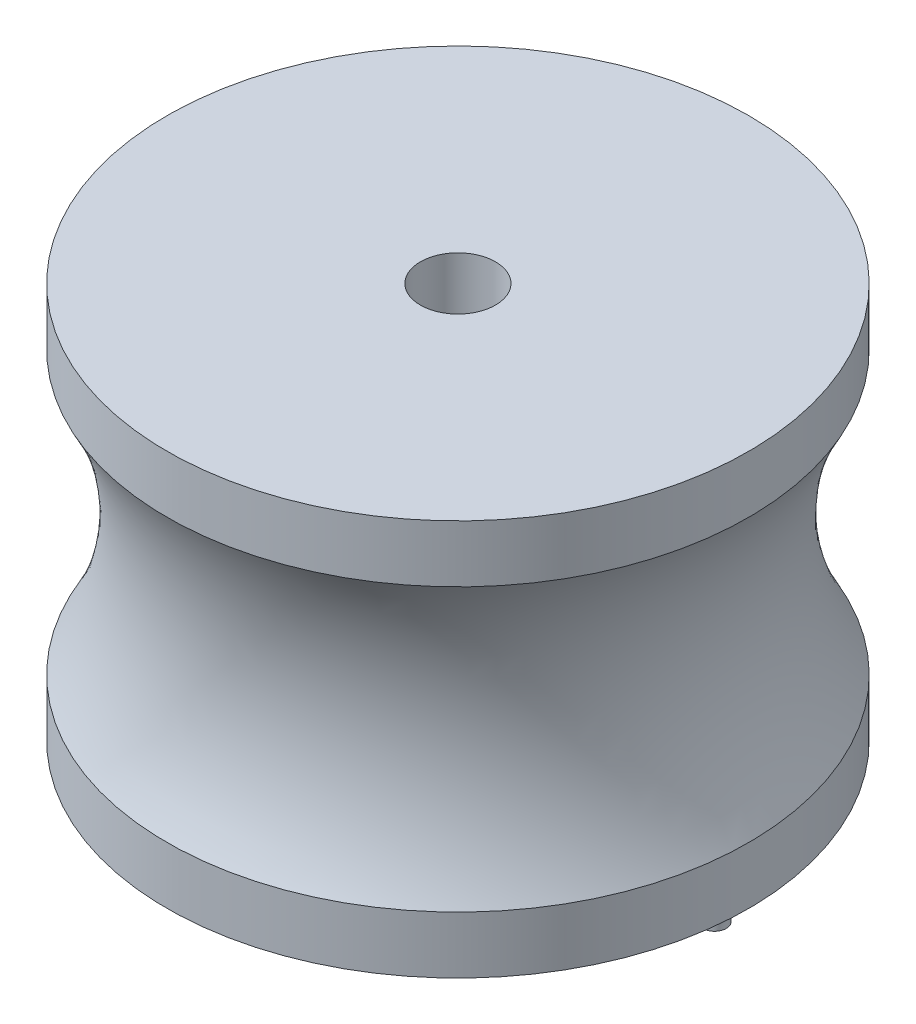
ISO-10303-21;
HEADER;
FILE_DESCRIPTION(('STEP AP214'),'2;1');
FILE_NAME('part.step','',(''),(''),'','','');
FILE_SCHEMA(('AUTOMOTIVE_DESIGN { 1 0 10303 214 1 1 1 1 }'));
ENDSEC;
DATA;
#1=APPLICATION_CONTEXT('core data for automotive mechanical design processes');
#2=APPLICATION_PROTOCOL_DEFINITION('international standard','automotive_design',2000,#1);
#3=PRODUCT_CONTEXT('',#1,'mechanical');
#4=PRODUCT('Part','Part','',(#3));
#5=PRODUCT_RELATED_PRODUCT_CATEGORY('part','',(#4));
#6=PRODUCT_DEFINITION_FORMATION('','',#4);
#7=PRODUCT_DEFINITION_CONTEXT('part definition',#1,'design');
#8=PRODUCT_DEFINITION('design','',#6,#7);
#9=PRODUCT_DEFINITION_SHAPE('','',#8);
#10=(LENGTH_UNIT() NAMED_UNIT(*) SI_UNIT(.MILLI.,.METRE.));
#11=(NAMED_UNIT(*) PLANE_ANGLE_UNIT() SI_UNIT($,.RADIAN.));
#12=(NAMED_UNIT(*) SI_UNIT($,.STERADIAN.) SOLID_ANGLE_UNIT());
#13=UNCERTAINTY_MEASURE_WITH_UNIT(LENGTH_MEASURE(1.E-05),#10,'distance_accuracy_value','');
#14=(GEOMETRIC_REPRESENTATION_CONTEXT(3) GLOBAL_UNCERTAINTY_ASSIGNED_CONTEXT((#13)) GLOBAL_UNIT_ASSIGNED_CONTEXT((#10,
#11,#12)) REPRESENTATION_CONTEXT('',''));
#15=CARTESIAN_POINT('',(0.,0.,0.));
#16=DIRECTION('',(0.,0.,1.));
#17=DIRECTION('',(1.,0.,0.));
#18=AXIS2_PLACEMENT_3D('',#15,#16,#17);
#19=CARTESIAN_POINT('',(0.,24.638,0.));
#20=DIRECTION('',(0.,-1.,0.));
#21=DIRECTION('',(0.,0.,-1.));
#22=AXIS2_PLACEMENT_3D('',#19,#20,#21);
#23=CYLINDRICAL_SURFACE('',#22,18.0975);
#24=CARTESIAN_POINT('',(0.,21.082,0.));
#25=DIRECTION('',(0.,1.,0.));
#26=DIRECTION('',(0.,0.,1.));
#27=AXIS2_PLACEMENT_3D('',#24,#25,#26);
#28=CIRCLE('',#27,18.0975);
#29=CARTESIAN_POINT('',(0.,21.082,-18.0975));
#30=VERTEX_POINT('',#29);
#31=EDGE_CURVE('E68',#30,#30,#28,.T.);
#32=CARTESIAN_POINT('',(0.,24.638,0.));
#33=DIRECTION('',(0.,1.,0.));
#34=DIRECTION('',(0.,0.,1.));
#35=AXIS2_PLACEMENT_3D('',#32,#33,#34);
#36=CIRCLE('',#35,18.0975);
#37=CARTESIAN_POINT('',(0.,24.638,-18.0975));
#38=VERTEX_POINT('',#37);
#39=EDGE_CURVE('E44',#38,#38,#36,.T.);
#40=CARTESIAN_POINT('',(0.,21.082,-18.0975));
#41=CARTESIAN_POINT('',(0.,21.1190416666667,-18.0975));
#42=CARTESIAN_POINT('',(0.,21.1560833333333,-18.0975));
#43=CARTESIAN_POINT('',(0.,21.2301666666667,-18.0975));
#44=CARTESIAN_POINT('',(0.,21.2672083333333,-18.0975));
#45=CARTESIAN_POINT('',(0.,21.3412916666667,-18.0975));
#46=CARTESIAN_POINT('',(0.,21.3783333333333,-18.0975));
#47=CARTESIAN_POINT('',(0.,21.4524166666667,-18.0975));
#48=CARTESIAN_POINT('',(0.,21.4894583333333,-18.0975));
#49=CARTESIAN_POINT('',(0.,21.5635416666667,-18.0975));
#50=CARTESIAN_POINT('',(0.,21.6005833333333,-18.0975));
#51=CARTESIAN_POINT('',(0.,21.6746666666667,-18.0975));
#52=CARTESIAN_POINT('',(0.,21.7117083333333,-18.0975));
#53=CARTESIAN_POINT('',(0.,21.7857916666667,-18.0975));
#54=CARTESIAN_POINT('',(0.,21.8228333333333,-18.0975));
#55=CARTESIAN_POINT('',(0.,21.8969166666667,-18.0975));
#56=CARTESIAN_POINT('',(0.,21.9339583333333,-18.0975));
#57=CARTESIAN_POINT('',(0.,22.0080416666667,-18.0975));
#58=CARTESIAN_POINT('',(0.,22.0450833333333,-18.0975));
#59=CARTESIAN_POINT('',(0.,22.1191666666667,-18.0975));
#60=CARTESIAN_POINT('',(0.,22.1562083333333,-18.0975));
#61=CARTESIAN_POINT('',(0.,22.2302916666667,-18.0975));
#62=CARTESIAN_POINT('',(0.,22.2673333333333,-18.0975));
#63=CARTESIAN_POINT('',(0.,22.3414166666667,-18.0975));
#64=CARTESIAN_POINT('',(0.,22.3784583333333,-18.0975));
#65=CARTESIAN_POINT('',(0.,22.4525416666667,-18.0975));
#66=CARTESIAN_POINT('',(0.,22.4895833333333,-18.0975));
#67=CARTESIAN_POINT('',(0.,22.5636666666667,-18.0975));
#68=CARTESIAN_POINT('',(0.,22.6007083333333,-18.0975));
#69=CARTESIAN_POINT('',(0.,22.6747916666667,-18.0975));
#70=CARTESIAN_POINT('',(0.,22.7118333333333,-18.0975));
#71=CARTESIAN_POINT('',(0.,22.7859166666667,-18.0975));
#72=CARTESIAN_POINT('',(0.,22.8229583333333,-18.0975));
#73=CARTESIAN_POINT('',(0.,22.8970416666667,-18.0975));
#74=CARTESIAN_POINT('',(0.,22.9340833333333,-18.0975));
#75=CARTESIAN_POINT('',(0.,23.0081666666667,-18.0975));
#76=CARTESIAN_POINT('',(0.,23.0452083333333,-18.0975));
#77=CARTESIAN_POINT('',(0.,23.1192916666667,-18.0975));
#78=CARTESIAN_POINT('',(0.,23.1563333333333,-18.0975));
#79=CARTESIAN_POINT('',(0.,23.2304166666667,-18.0975));
#80=CARTESIAN_POINT('',(0.,23.2674583333333,-18.0975));
#81=CARTESIAN_POINT('',(0.,23.3415416666667,-18.0975));
#82=CARTESIAN_POINT('',(0.,23.3785833333333,-18.0975));
#83=CARTESIAN_POINT('',(0.,23.4526666666667,-18.0975));
#84=CARTESIAN_POINT('',(0.,23.4897083333333,-18.0975));
#85=CARTESIAN_POINT('',(0.,23.5637916666667,-18.0975));
#86=CARTESIAN_POINT('',(0.,23.6008333333333,-18.0975));
#87=CARTESIAN_POINT('',(0.,23.6749166666667,-18.0975));
#88=CARTESIAN_POINT('',(0.,23.7119583333333,-18.0975));
#89=CARTESIAN_POINT('',(0.,23.7860416666667,-18.0975));
#90=CARTESIAN_POINT('',(0.,23.8230833333333,-18.0975));
#91=CARTESIAN_POINT('',(0.,23.8971666666667,-18.0975));
#92=CARTESIAN_POINT('',(0.,23.9342083333333,-18.0975));
#93=CARTESIAN_POINT('',(0.,24.0082916666667,-18.0975));
#94=CARTESIAN_POINT('',(0.,24.0453333333333,-18.0975));
#95=CARTESIAN_POINT('',(0.,24.1194166666667,-18.0975));
#96=CARTESIAN_POINT('',(0.,24.1564583333333,-18.0975));
#97=CARTESIAN_POINT('',(0.,24.2305416666667,-18.0975));
#98=CARTESIAN_POINT('',(0.,24.2675833333333,-18.0975));
#99=CARTESIAN_POINT('',(0.,24.3416666666667,-18.0975));
#100=CARTESIAN_POINT('',(0.,24.3787083333333,-18.0975));
#101=CARTESIAN_POINT('',(0.,24.4527916666667,-18.0975));
#102=CARTESIAN_POINT('',(0.,24.4898333333333,-18.0975));
#103=CARTESIAN_POINT('',(0.,24.5639166666667,-18.0975));
#104=CARTESIAN_POINT('',(0.,24.6009583333333,-18.0975));
#105=CARTESIAN_POINT('',(0.,24.638,-18.0975));
#106=B_SPLINE_CURVE_WITH_KNOTS('',3,(#40,#41,#42,#43,#44,#45,#46,#47,#48,#49,#50,#51,#52,#53,
#54,#55,#56,#57,#58,#59,#60,#61,#62,#63,#64,#65,#66,#67,#68,#69,#70,#71,#72,#73,#74,#75,#76,#77,
#78,#79,#80,#81,#82,#83,#84,#85,#86,#87,#88,#89,#90,#91,#92,#93,#94,#95,#96,#97,#98,#99,#100,
#101,#102,#103,#104,#105),.UNSPECIFIED.,.F.,.F.,(4,2,2,2,2,2,2,2,2,2,2,2,2,2,2,2,2,2,2,2,2,2,2,
2,2,2,2,2,2,2,2,2,4),(0.,0.111125,0.22225,0.333375,0.444499999999997,0.555625000000001,
0.666749999999997,0.777874999999997,0.888999999999997,1.000125,1.11125,1.222375,1.3335,1.444625,
1.55575,1.666875,1.778,1.889125,2.00025,2.111375,2.2225,2.333625,2.44475,2.555875,2.667,
2.778125,2.88925,3.000375,3.1115,3.222625,3.33375,3.444875,3.556),.UNSPECIFIED.);
#107=EDGE_CURVE('BSEAM33',#30,#38,#106,.T.);
#108=ORIENTED_EDGE('',*,*,#31,.T.);
#109=ORIENTED_EDGE('',*,*,#39,.F.);
#110=ORIENTED_EDGE('',*,*,#107,.T.);
#111=ORIENTED_EDGE('',*,*,#107,.F.);
#112=EDGE_LOOP('',(#108,#110,#109,#111));
#113=FACE_BOUND('',#112,.T.);
#114=ADVANCED_FACE('F33',(#113),#23,.T.);
#115=CARTESIAN_POINT('',(0.,0.,0.));
#116=DIRECTION('',(0.,1.,0.));
#117=DIRECTION('',(0.,0.,1.));
#118=AXIS2_PLACEMENT_3D('',#115,#116,#117);
#119=PLANE('',#118);
#120=CARTESIAN_POINT('',(15.9729956173591,0.,0.));
#121=DIRECTION('',(0.,1.,0.));
#122=DIRECTION('',(0.,0.,1.));
#123=AXIS2_PLACEMENT_3D('',#120,#121,#122);
#124=CIRCLE('',#123,0.723899999999999);
#125=CARTESIAN_POINT('',(15.9729956173591,0.,0.723899999999999));
#126=VERTEX_POINT('',#125);
#127=EDGE_CURVE('E40',#126,#126,#124,.F.);
#128=ORIENTED_EDGE('',*,*,#127,.F.);
#129=EDGE_LOOP('',(#128));
#130=FACE_BOUND('',#129,.T.);
#131=CARTESIAN_POINT('',(0.,0.,0.));
#132=DIRECTION('',(0.,1.,0.));
#133=DIRECTION('',(0.,0.,1.));
#134=AXIS2_PLACEMENT_3D('',#131,#132,#133);
#135=CIRCLE('',#134,2.3368);
#136=CARTESIAN_POINT('',(0.,0.,2.3368));
#137=VERTEX_POINT('',#136);
#138=EDGE_CURVE('E52',#137,#137,#135,.T.);
#139=ORIENTED_EDGE('',*,*,#138,.T.);
#140=EDGE_LOOP('',(#139));
#141=FACE_BOUND('',#140,.T.);
#142=CARTESIAN_POINT('',(0.,0.,0.));
#143=DIRECTION('',(0.,1.,0.));
#144=DIRECTION('',(0.,0.,1.));
#145=AXIS2_PLACEMENT_3D('',#142,#143,#144);
#146=CIRCLE('',#145,18.0975);
#147=CARTESIAN_POINT('',(0.,0.,-18.0975));
#148=VERTEX_POINT('',#147);
#149=EDGE_CURVE('E48',#148,#148,#146,.T.);
#150=ORIENTED_EDGE('',*,*,#149,.F.);
#151=EDGE_LOOP('',(#150));
#152=FACE_BOUND('',#151,.T.);
#153=CARTESIAN_POINT('',(-16.8471977255182,0.,0.));
#154=DIRECTION('',(0.,1.,0.));
#155=DIRECTION('',(0.,0.,1.));
#156=AXIS2_PLACEMENT_3D('',#153,#154,#155);
#157=CIRCLE('',#156,0.723899999999999);
#158=CARTESIAN_POINT('',(-16.8471977255182,0.,0.723899999999999));
#159=VERTEX_POINT('',#158);
#160=EDGE_CURVE('E10',#159,#159,#157,.F.);
#161=ORIENTED_EDGE('',*,*,#160,.F.);
#162=EDGE_LOOP('',(#161));
#163=FACE_BOUND('',#162,.T.);
#164=ADVANCED_FACE('F84',(#130,#141,#152,#163),#119,.F.);
#165=CARTESIAN_POINT('',(0.,3.556,0.));
#166=DIRECTION('',(0.,1.,0.));
#167=DIRECTION('',(0.,0.,1.));
#168=AXIS2_PLACEMENT_3D('',#165,#166,#167);
#169=CIRCLE('',#168,18.0975);
#170=CARTESIAN_POINT('',(0.,3.556,-18.0975));
#171=VERTEX_POINT('',#170);
#172=EDGE_CURVE('E65',#171,#171,#169,.T.);
#173=CARTESIAN_POINT('',(0.,3.556,-18.0975));
#174=CARTESIAN_POINT('',(0.,3.51895833333333,-18.0975));
#175=CARTESIAN_POINT('',(0.,3.48191666666667,-18.0975));
#176=CARTESIAN_POINT('',(0.,3.40783333333333,-18.0975));
#177=CARTESIAN_POINT('',(0.,3.37079166666667,-18.0975));
#178=CARTESIAN_POINT('',(0.,3.29670833333333,-18.0975));
#179=CARTESIAN_POINT('',(0.,3.25966666666667,-18.0975));
#180=CARTESIAN_POINT('',(0.,3.18558333333333,-18.0975));
#181=CARTESIAN_POINT('',(0.,3.14854166666667,-18.0975));
#182=CARTESIAN_POINT('',(0.,3.07445833333333,-18.0975));
#183=CARTESIAN_POINT('',(0.,3.03741666666667,-18.0975));
#184=CARTESIAN_POINT('',(0.,2.96333333333333,-18.0975));
#185=CARTESIAN_POINT('',(0.,2.92629166666667,-18.0975));
#186=CARTESIAN_POINT('',(0.,2.85220833333333,-18.0975));
#187=CARTESIAN_POINT('',(0.,2.81516666666667,-18.0975));
#188=CARTESIAN_POINT('',(0.,2.74108333333333,-18.0975));
#189=CARTESIAN_POINT('',(0.,2.70404166666667,-18.0975));
#190=CARTESIAN_POINT('',(0.,2.62995833333333,-18.0975));
#191=CARTESIAN_POINT('',(0.,2.59291666666667,-18.0975));
#192=CARTESIAN_POINT('',(0.,2.51883333333333,-18.0975));
#193=CARTESIAN_POINT('',(0.,2.48179166666667,-18.0975));
#194=CARTESIAN_POINT('',(0.,2.40770833333333,-18.0975));
#195=CARTESIAN_POINT('',(0.,2.37066666666667,-18.0975));
#196=CARTESIAN_POINT('',(0.,2.29658333333333,-18.0975));
#197=CARTESIAN_POINT('',(0.,2.25954166666667,-18.0975));
#198=CARTESIAN_POINT('',(0.,2.18545833333333,-18.0975));
#199=CARTESIAN_POINT('',(0.,2.14841666666667,-18.0975));
#200=CARTESIAN_POINT('',(0.,2.07433333333333,-18.0975));
#201=CARTESIAN_POINT('',(0.,2.03729166666667,-18.0975));
#202=CARTESIAN_POINT('',(0.,1.96320833333333,-18.0975));
#203=CARTESIAN_POINT('',(0.,1.92616666666667,-18.0975));
#204=CARTESIAN_POINT('',(0.,1.85208333333333,-18.0975));
#205=CARTESIAN_POINT('',(0.,1.81504166666667,-18.0975));
#206=CARTESIAN_POINT('',(0.,1.74095833333333,-18.0975));
#207=CARTESIAN_POINT('',(0.,1.70391666666666,-18.0975));
#208=CARTESIAN_POINT('',(0.,1.62983333333333,-18.0975));
#209=CARTESIAN_POINT('',(0.,1.59279166666666,-18.0975));
#210=CARTESIAN_POINT('',(0.,1.51870833333333,-18.0975));
#211=CARTESIAN_POINT('',(0.,1.48166666666666,-18.0975));
#212=CARTESIAN_POINT('',(0.,1.40758333333333,-18.0975));
#213=CARTESIAN_POINT('',(0.,1.37054166666666,-18.0975));
#214=CARTESIAN_POINT('',(0.,1.29645833333333,-18.0975));
#215=CARTESIAN_POINT('',(0.,1.25941666666666,-18.0975));
#216=CARTESIAN_POINT('',(0.,1.18533333333333,-18.0975));
#217=CARTESIAN_POINT('',(0.,1.14829166666666,-18.0975));
#218=CARTESIAN_POINT('',(0.,1.07420833333333,-18.0975));
#219=CARTESIAN_POINT('',(0.,1.03716666666666,-18.0975));
#220=CARTESIAN_POINT('',(0.,0.963083333333331,-18.0975));
#221=CARTESIAN_POINT('',(0.,0.926041666666664,-18.0975));
#222=CARTESIAN_POINT('',(0.,0.851958333333331,-18.0975));
#223=CARTESIAN_POINT('',(0.,0.814916666666664,-18.0975));
#224=CARTESIAN_POINT('',(0.,0.740833333333331,-18.0975));
#225=CARTESIAN_POINT('',(0.,0.703791666666664,-18.0975));
#226=CARTESIAN_POINT('',(0.,0.629708333333331,-18.0975));
#227=CARTESIAN_POINT('',(0.,0.592666666666664,-18.0975));
#228=CARTESIAN_POINT('',(0.,0.51858333333333,-18.0975));
#229=CARTESIAN_POINT('',(0.,0.481541666666664,-18.0975));
#230=CARTESIAN_POINT('',(0.,0.40745833333333,-18.0975));
#231=CARTESIAN_POINT('',(0.,0.370416666666664,-18.0975));
#232=CARTESIAN_POINT('',(0.,0.29633333333333,-18.0975));
#233=CARTESIAN_POINT('',(0.,0.259291666666663,-18.0975));
#234=CARTESIAN_POINT('',(0.,0.18520833333333,-18.0975));
#235=CARTESIAN_POINT('',(0.,0.148166666666663,-18.0975));
#236=CARTESIAN_POINT('',(0.,0.07408333333333,-18.0975));
#237=CARTESIAN_POINT('',(0.,0.0370416666666633,-18.0975));
#238=CARTESIAN_POINT('',(0.,0.,-18.0975));
#239=B_SPLINE_CURVE_WITH_KNOTS('',3,(#173,#174,#175,#176,#177,#178,#179,#180,#181,#182,#183,
#184,#185,#186,#187,#188,#189,#190,#191,#192,#193,#194,#195,#196,#197,#198,#199,#200,#201,#202,
#203,#204,#205,#206,#207,#208,#209,#210,#211,#212,#213,#214,#215,#216,#217,#218,#219,#220,#221,
#222,#223,#224,#225,#226,#227,#228,#229,#230,#231,#232,#233,#234,#235,#236,#237,#238),
.UNSPECIFIED.,.F.,.F.,(4,2,2,2,2,2,2,2,2,2,2,2,2,2,2,2,2,2,2,2,2,2,2,2,2,2,2,2,2,2,2,2,4),(0.,
0.111125,0.22225,0.333375,0.4445,0.555625000000001,0.666750000000001,0.777875000000001,
0.889000000000001,1.000125,1.11125,1.222375,1.3335,1.444625,1.55575,1.666875,1.778,1.889125,
2.00025,2.111375,2.2225,2.333625,2.44475,2.555875,2.667,2.778125,2.88925,3.000375,3.1115,
3.222625,3.33375,3.444875,3.556),.UNSPECIFIED.);
#240=EDGE_CURVE('BSEAM35',#171,#148,#239,.T.);
#241=ORIENTED_EDGE('',*,*,#172,.F.);
#242=ORIENTED_EDGE('',*,*,#149,.T.);
#243=ORIENTED_EDGE('',*,*,#240,.T.);
#244=ORIENTED_EDGE('',*,*,#240,.F.);
#245=EDGE_LOOP('',(#241,#243,#242,#244));
#246=FACE_BOUND('',#245,.T.);
#247=ADVANCED_FACE('F35',(#246),#23,.T.);
#248=CARTESIAN_POINT('',(0.,24.638,0.));
#249=DIRECTION('',(0.,1.,0.));
#250=DIRECTION('',(0.,0.,1.));
#251=AXIS2_PLACEMENT_3D('',#248,#249,#250);
#252=PLANE('',#251);
#253=CARTESIAN_POINT('',(0.,24.638,0.));
#254=DIRECTION('',(0.,1.,0.));
#255=DIRECTION('',(0.,0.,1.));
#256=AXIS2_PLACEMENT_3D('',#253,#254,#255);
#257=CIRCLE('',#256,2.3368);
#258=CARTESIAN_POINT('',(0.,24.638,2.3368));
#259=VERTEX_POINT('',#258);
#260=EDGE_CURVE('E54',#259,#259,#257,.T.);
#261=ORIENTED_EDGE('',*,*,#260,.F.);
#262=EDGE_LOOP('',(#261));
#263=FACE_BOUND('',#262,.T.);
#264=ORIENTED_EDGE('',*,*,#39,.T.);
#265=EDGE_LOOP('',(#264));
#266=FACE_BOUND('',#265,.T.);
#267=ADVANCED_FACE('F83',(#263,#266),#252,.T.);
#268=CARTESIAN_POINT('',(0.,0.,0.));
#269=DIRECTION('',(0.,1.,0.));
#270=DIRECTION('',(0.,0.,1.));
#271=AXIS2_PLACEMENT_3D('',#268,#269,#270);
#272=CYLINDRICAL_SURFACE('',#271,2.3368);
#273=CARTESIAN_POINT('',(0.,0.,2.3368));
#274=CARTESIAN_POINT('',(0.,0.256645833333333,2.3368));
#275=CARTESIAN_POINT('',(0.,0.513291666666666,2.3368));
#276=CARTESIAN_POINT('',(0.,1.02658333333333,2.3368));
#277=CARTESIAN_POINT('',(0.,1.28322916666667,2.3368));
#278=CARTESIAN_POINT('',(0.,1.79652083333333,2.3368));
#279=CARTESIAN_POINT('',(0.,2.05316666666667,2.3368));
#280=CARTESIAN_POINT('',(0.,2.56645833333333,2.3368));
#281=CARTESIAN_POINT('',(0.,2.82310416666667,2.3368));
#282=CARTESIAN_POINT('',(0.,3.33639583333333,2.3368));
#283=CARTESIAN_POINT('',(0.,3.59304166666667,2.3368));
#284=CARTESIAN_POINT('',(0.,4.10633333333333,2.3368));
#285=CARTESIAN_POINT('',(0.,4.36297916666667,2.3368));
#286=CARTESIAN_POINT('',(0.,4.87627083333333,2.3368));
#287=CARTESIAN_POINT('',(0.,5.13291666666667,2.3368));
#288=CARTESIAN_POINT('',(0.,5.64620833333333,2.3368));
#289=CARTESIAN_POINT('',(0.,5.90285416666667,2.3368));
#290=CARTESIAN_POINT('',(0.,6.41614583333333,2.3368));
#291=CARTESIAN_POINT('',(0.,6.67279166666667,2.3368));
#292=CARTESIAN_POINT('',(0.,7.18608333333333,2.3368));
#293=CARTESIAN_POINT('',(0.,7.44272916666667,2.3368));
#294=CARTESIAN_POINT('',(0.,7.95602083333333,2.3368));
#295=CARTESIAN_POINT('',(0.,8.21266666666667,2.3368));
#296=CARTESIAN_POINT('',(0.,8.72595833333333,2.3368));
#297=CARTESIAN_POINT('',(0.,8.98260416666666,2.3368));
#298=CARTESIAN_POINT('',(0.,9.49589583333333,2.3368));
#299=CARTESIAN_POINT('',(0.,9.75254166666667,2.3368));
#300=CARTESIAN_POINT('',(0.,10.2658333333333,2.3368));
#301=CARTESIAN_POINT('',(0.,10.5224791666667,2.3368));
#302=CARTESIAN_POINT('',(0.,11.0357708333333,2.3368));
#303=CARTESIAN_POINT('',(0.,11.2924166666667,2.3368));
#304=CARTESIAN_POINT('',(0.,11.8057083333333,2.3368));
#305=CARTESIAN_POINT('',(0.,12.0623541666667,2.3368));
#306=CARTESIAN_POINT('',(0.,12.5756458333333,2.3368));
#307=CARTESIAN_POINT('',(0.,12.8322916666667,2.3368));
#308=CARTESIAN_POINT('',(0.,13.3455833333333,2.3368));
#309=CARTESIAN_POINT('',(0.,13.6022291666667,2.3368));
#310=CARTESIAN_POINT('',(0.,14.1155208333333,2.3368));
#311=CARTESIAN_POINT('',(0.,14.3721666666667,2.3368));
#312=CARTESIAN_POINT('',(0.,14.8854583333333,2.3368));
#313=CARTESIAN_POINT('',(0.,15.1421041666667,2.3368));
#314=CARTESIAN_POINT('',(0.,15.6553958333333,2.3368));
#315=CARTESIAN_POINT('',(0.,15.9120416666667,2.3368));
#316=CARTESIAN_POINT('',(0.,16.4253333333333,2.3368));
#317=CARTESIAN_POINT('',(0.,16.6819791666667,2.3368));
#318=CARTESIAN_POINT('',(0.,17.1952708333333,2.3368));
#319=CARTESIAN_POINT('',(0.,17.4519166666667,2.3368));
#320=CARTESIAN_POINT('',(0.,17.9652083333333,2.3368));
#321=CARTESIAN_POINT('',(0.,18.2218541666667,2.3368));
#322=CARTESIAN_POINT('',(0.,18.7351458333333,2.3368));
#323=CARTESIAN_POINT('',(0.,18.9917916666667,2.3368));
#324=CARTESIAN_POINT('',(0.,19.5050833333333,2.3368));
#325=CARTESIAN_POINT('',(0.,19.7617291666667,2.3368));
#326=CARTESIAN_POINT('',(0.,20.2750208333333,2.3368));
#327=CARTESIAN_POINT('',(0.,20.5316666666667,2.3368));
#328=CARTESIAN_POINT('',(0.,21.0449583333333,2.3368));
#329=CARTESIAN_POINT('',(0.,21.3016041666667,2.3368));
#330=CARTESIAN_POINT('',(0.,21.8148958333333,2.3368));
#331=CARTESIAN_POINT('',(0.,22.0715416666667,2.3368));
#332=CARTESIAN_POINT('',(0.,22.5848333333333,2.3368));
#333=CARTESIAN_POINT('',(0.,22.8414791666667,2.3368));
#334=CARTESIAN_POINT('',(0.,23.3547708333333,2.3368));
#335=CARTESIAN_POINT('',(0.,23.6114166666667,2.3368));
#336=CARTESIAN_POINT('',(0.,24.1247083333333,2.3368));
#337=CARTESIAN_POINT('',(0.,24.3813541666667,2.3368));
#338=CARTESIAN_POINT('',(0.,24.638,2.3368));
#339=B_SPLINE_CURVE_WITH_KNOTS('',3,(#273,#274,#275,#276,#277,#278,#279,#280,#281,#282,#283,
#284,#285,#286,#287,#288,#289,#290,#291,#292,#293,#294,#295,#296,#297,#298,#299,#300,#301,#302,
#303,#304,#305,#306,#307,#308,#309,#310,#311,#312,#313,#314,#315,#316,#317,#318,#319,#320,#321,
#322,#323,#324,#325,#326,#327,#328,#329,#330,#331,#332,#333,#334,#335,#336,#337,#338),
.UNSPECIFIED.,.F.,.F.,(4,2,2,2,2,2,2,2,2,2,2,2,2,2,2,2,2,2,2,2,2,2,2,2,2,2,2,2,2,2,2,2,4),(0.,
0.7699375,1.539875,2.3098125,3.07975,3.8496875,4.619625,5.3895625,6.1595,6.9294375,7.699375,
8.4693125,9.23925,10.0091875,10.779125,11.5490625,12.319,13.0889375,13.858875,14.6288125,
15.39875,16.1686875,16.938625,17.7085625,18.4785,19.2484375,20.018375,20.7883125,21.55825,
22.3281875,23.098125,23.8680625,24.638),.UNSPECIFIED.);
#340=EDGE_CURVE('BSEAM97',#137,#259,#339,.T.);
#341=ORIENTED_EDGE('',*,*,#138,.F.);
#342=ORIENTED_EDGE('',*,*,#260,.T.);
#343=ORIENTED_EDGE('',*,*,#340,.T.);
#344=ORIENTED_EDGE('',*,*,#340,.F.);
#345=EDGE_LOOP('',(#341,#343,#342,#344));
#346=FACE_BOUND('',#345,.T.);
#347=ADVANCED_FACE('F97',(#346),#272,.F.);
#348=CARTESIAN_POINT('',(15.9729956173591,-1.778,0.));
#349=DIRECTION('',(0.,1.,0.));
#350=DIRECTION('',(0.,0.,1.));
#351=AXIS2_PLACEMENT_3D('',#348,#349,#350);
#352=CYLINDRICAL_SURFACE('',#351,0.723899999999999);
#353=CARTESIAN_POINT('',(15.9729956173591,-1.778,0.));
#354=DIRECTION('',(0.,-1.,0.));
#355=DIRECTION('',(0.,0.,-1.));
#356=AXIS2_PLACEMENT_3D('',#353,#354,#355);
#357=CIRCLE('',#356,0.723899999999999);
#358=CARTESIAN_POINT('',(15.9729956173591,-1.778,-0.723899999999999));
#359=VERTEX_POINT('',#358);
#360=EDGE_CURVE('E57',#359,#359,#357,.T.);
#361=ORIENTED_EDGE('',*,*,#360,.F.);
#362=EDGE_LOOP('',(#361));
#363=FACE_BOUND('',#362,.T.);
#364=ORIENTED_EDGE('',*,*,#127,.T.);
#365=EDGE_LOOP('',(#364));
#366=FACE_BOUND('',#365,.T.);
#367=ADVANCED_FACE('F101',(#363,#366),#352,.T.);
#368=CARTESIAN_POINT('',(15.9729956173591,-1.778,0.));
#369=DIRECTION('',(0.,-1.,0.));
#370=DIRECTION('',(0.,0.,-1.));
#371=AXIS2_PLACEMENT_3D('',#368,#369,#370);
#372=PLANE('',#371);
#373=ORIENTED_EDGE('',*,*,#360,.T.);
#374=EDGE_LOOP('',(#373));
#375=FACE_BOUND('',#374,.T.);
#376=ADVANCED_FACE('F105',(#375),#372,.T.);
#377=CARTESIAN_POINT('',(-16.8471977255182,-1.778,0.));
#378=DIRECTION('',(0.,1.,0.));
#379=DIRECTION('',(0.,0.,1.));
#380=AXIS2_PLACEMENT_3D('',#377,#378,#379);
#381=CYLINDRICAL_SURFACE('',#380,0.723899999999999);
#382=CARTESIAN_POINT('',(-16.8471977255182,-1.778,0.));
#383=DIRECTION('',(0.,-1.,0.));
#384=DIRECTION('',(0.,0.,-1.));
#385=AXIS2_PLACEMENT_3D('',#382,#383,#384);
#386=CIRCLE('',#385,0.723899999999999);
#387=CARTESIAN_POINT('',(-16.8471977255182,-1.778,-0.723899999999999));
#388=VERTEX_POINT('',#387);
#389=EDGE_CURVE('E62',#388,#388,#386,.T.);
#390=ORIENTED_EDGE('',*,*,#389,.F.);
#391=EDGE_LOOP('',(#390));
#392=FACE_BOUND('',#391,.T.);
#393=ORIENTED_EDGE('',*,*,#160,.T.);
#394=EDGE_LOOP('',(#393));
#395=FACE_BOUND('',#394,.T.);
#396=ADVANCED_FACE('F109',(#392,#395),#381,.T.);
#397=CARTESIAN_POINT('',(-16.8471977255182,-1.778,0.));
#398=DIRECTION('',(0.,-1.,0.));
#399=DIRECTION('',(0.,0.,-1.));
#400=AXIS2_PLACEMENT_3D('',#397,#398,#399);
#401=PLANE('',#400);
#402=ORIENTED_EDGE('',*,*,#389,.T.);
#403=EDGE_LOOP('',(#402));
#404=FACE_BOUND('',#403,.T.);
#405=ADVANCED_FACE('F77',(#404),#401,.T.);
#406=CARTESIAN_POINT('',(0.,12.319,0.));
#407=DIRECTION('',(0.,1.,0.));
#408=DIRECTION('',(0.,0.,1.));
#409=AXIS2_PLACEMENT_3D('',#406,#407,#408);
#410=TOROIDAL_SURFACE('',#409,33.2645608108108,17.5165608108108);
#411=ORIENTED_EDGE('',*,*,#31,.F.);
#412=EDGE_LOOP('',(#411));
#413=FACE_BOUND('',#412,.T.);
#414=ORIENTED_EDGE('',*,*,#172,.T.);
#415=EDGE_LOOP('',(#414));
#416=FACE_BOUND('',#415,.T.);
#417=ADVANCED_FACE('F74',(#413,#416),#410,.F.);
#418=CLOSED_SHELL('',(#114,#164,#247,#267,#347,#367,#376,#396,#405,#417));
#419=MANIFOLD_SOLID_BREP('B2',#418);
#420=ADVANCED_BREP_SHAPE_REPRESENTATION('',(#18,#419),#14);
#421=SHAPE_DEFINITION_REPRESENTATION(#9,#420);
ENDSEC;
END-ISO-10303-21;
